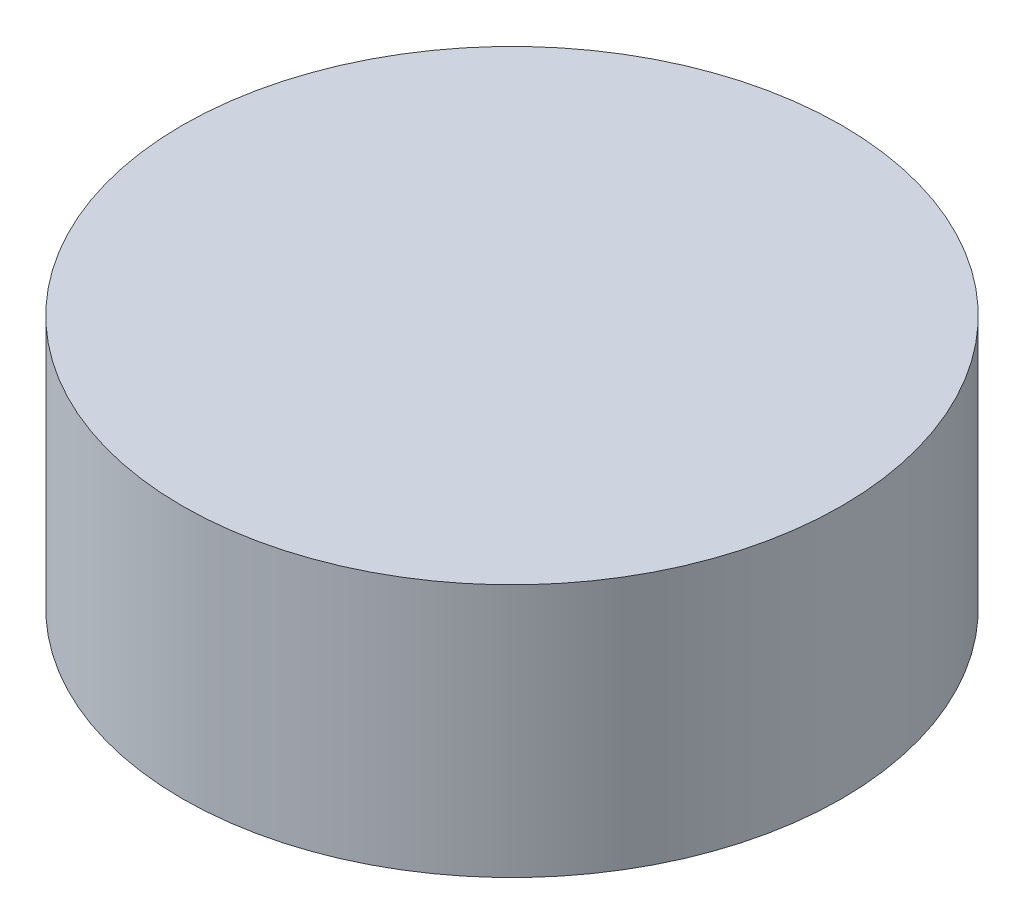
ISO-10303-21;
HEADER;
FILE_DESCRIPTION(('STEP AP214'),'2;1');
FILE_NAME('part.step','',(''),(''),'','','');
FILE_SCHEMA(('AUTOMOTIVE_DESIGN { 1 0 10303 214 1 1 1 1 }'));
ENDSEC;
DATA;
#1=APPLICATION_CONTEXT('core data for automotive mechanical design processes');
#2=APPLICATION_PROTOCOL_DEFINITION('international standard','automotive_design',2000,#1);
#3=PRODUCT_CONTEXT('',#1,'mechanical');
#4=PRODUCT('Part','Part','',(#3));
#5=PRODUCT_RELATED_PRODUCT_CATEGORY('part','',(#4));
#6=PRODUCT_DEFINITION_FORMATION('','',#4);
#7=PRODUCT_DEFINITION_CONTEXT('part definition',#1,'design');
#8=PRODUCT_DEFINITION('design','',#6,#7);
#9=PRODUCT_DEFINITION_SHAPE('','',#8);
#10=(LENGTH_UNIT() NAMED_UNIT(*) SI_UNIT(.MILLI.,.METRE.));
#11=(NAMED_UNIT(*) PLANE_ANGLE_UNIT() SI_UNIT($,.RADIAN.));
#12=(NAMED_UNIT(*) SI_UNIT($,.STERADIAN.) SOLID_ANGLE_UNIT());
#13=UNCERTAINTY_MEASURE_WITH_UNIT(LENGTH_MEASURE(1.E-05),#10,'distance_accuracy_value','');
#14=(GEOMETRIC_REPRESENTATION_CONTEXT(3) GLOBAL_UNCERTAINTY_ASSIGNED_CONTEXT((#13)) GLOBAL_UNIT_ASSIGNED_CONTEXT((#10,
#11,#12)) REPRESENTATION_CONTEXT('',''));
#15=CARTESIAN_POINT('',(0.,0.,0.));
#16=DIRECTION('',(0.,0.,1.));
#17=DIRECTION('',(1.,0.,0.));
#18=AXIS2_PLACEMENT_3D('',#15,#16,#17);
#19=CARTESIAN_POINT('',(0.,24.8,0.));
#20=DIRECTION('',(0.,-1.,0.));
#21=DIRECTION('',(0.,0.,-1.));
#22=AXIS2_PLACEMENT_3D('',#19,#20,#21);
#23=CYLINDRICAL_SURFACE('',#22,32.25);
#24=CARTESIAN_POINT('',(0.,24.8,0.));
#25=DIRECTION('',(0.,1.,0.));
#26=DIRECTION('',(0.,0.,1.));
#27=AXIS2_PLACEMENT_3D('',#24,#25,#26);
#28=CIRCLE('',#27,32.25);
#29=CARTESIAN_POINT('',(0.,24.8,-32.25));
#30=VERTEX_POINT('',#29);
#31=EDGE_CURVE('E10',#30,#30,#28,.T.);
#32=CARTESIAN_POINT('',(0.,0.,0.));
#33=DIRECTION('',(0.,1.,0.));
#34=DIRECTION('',(0.,0.,1.));
#35=AXIS2_PLACEMENT_3D('',#32,#33,#34);
#36=CIRCLE('',#35,32.25);
#37=CARTESIAN_POINT('',(0.,0.,-32.25));
#38=VERTEX_POINT('',#37);
#39=EDGE_CURVE('E35',#38,#38,#36,.T.);
#40=CARTESIAN_POINT('',(0.,24.8,-32.25));
#41=CARTESIAN_POINT('',(0.,24.5416666666667,-32.25));
#42=CARTESIAN_POINT('',(0.,24.2833333333333,-32.25));
#43=CARTESIAN_POINT('',(0.,23.7666666666667,-32.25));
#44=CARTESIAN_POINT('',(0.,23.5083333333333,-32.25));
#45=CARTESIAN_POINT('',(0.,22.9916666666667,-32.25));
#46=CARTESIAN_POINT('',(0.,22.7333333333333,-32.25));
#47=CARTESIAN_POINT('',(0.,22.2166666666667,-32.25));
#48=CARTESIAN_POINT('',(0.,21.9583333333333,-32.25));
#49=CARTESIAN_POINT('',(0.,21.4416666666667,-32.25));
#50=CARTESIAN_POINT('',(0.,21.1833333333333,-32.25));
#51=CARTESIAN_POINT('',(0.,20.6666666666667,-32.25));
#52=CARTESIAN_POINT('',(0.,20.4083333333333,-32.25));
#53=CARTESIAN_POINT('',(0.,19.8916666666667,-32.25));
#54=CARTESIAN_POINT('',(0.,19.6333333333333,-32.25));
#55=CARTESIAN_POINT('',(0.,19.1166666666667,-32.25));
#56=CARTESIAN_POINT('',(0.,18.8583333333333,-32.25));
#57=CARTESIAN_POINT('',(0.,18.3416666666667,-32.25));
#58=CARTESIAN_POINT('',(0.,18.0833333333333,-32.25));
#59=CARTESIAN_POINT('',(0.,17.5666666666667,-32.25));
#60=CARTESIAN_POINT('',(0.,17.3083333333333,-32.25));
#61=CARTESIAN_POINT('',(0.,16.7916666666667,-32.25));
#62=CARTESIAN_POINT('',(0.,16.5333333333333,-32.25));
#63=CARTESIAN_POINT('',(0.,16.0166666666667,-32.25));
#64=CARTESIAN_POINT('',(0.,15.7583333333333,-32.25));
#65=CARTESIAN_POINT('',(0.,15.2416666666667,-32.25));
#66=CARTESIAN_POINT('',(0.,14.9833333333333,-32.25));
#67=CARTESIAN_POINT('',(0.,14.4666666666667,-32.25));
#68=CARTESIAN_POINT('',(0.,14.2083333333333,-32.25));
#69=CARTESIAN_POINT('',(0.,13.6916666666667,-32.25));
#70=CARTESIAN_POINT('',(0.,13.4333333333333,-32.25));
#71=CARTESIAN_POINT('',(0.,12.9166666666667,-32.25));
#72=CARTESIAN_POINT('',(0.,12.6583333333333,-32.25));
#73=CARTESIAN_POINT('',(0.,12.1416666666667,-32.25));
#74=CARTESIAN_POINT('',(0.,11.8833333333333,-32.25));
#75=CARTESIAN_POINT('',(0.,11.3666666666667,-32.25));
#76=CARTESIAN_POINT('',(0.,11.1083333333333,-32.25));
#77=CARTESIAN_POINT('',(0.,10.5916666666667,-32.25));
#78=CARTESIAN_POINT('',(0.,10.3333333333333,-32.25));
#79=CARTESIAN_POINT('',(0.,9.81666666666666,-32.25));
#80=CARTESIAN_POINT('',(0.,9.55833333333333,-32.25));
#81=CARTESIAN_POINT('',(0.,9.04166666666666,-32.25));
#82=CARTESIAN_POINT('',(0.,8.78333333333333,-32.25));
#83=CARTESIAN_POINT('',(0.,8.26666666666667,-32.25));
#84=CARTESIAN_POINT('',(0.,8.00833333333333,-32.25));
#85=CARTESIAN_POINT('',(0.,7.49166666666667,-32.25));
#86=CARTESIAN_POINT('',(0.,7.23333333333333,-32.25));
#87=CARTESIAN_POINT('',(0.,6.71666666666667,-32.25));
#88=CARTESIAN_POINT('',(0.,6.45833333333333,-32.25));
#89=CARTESIAN_POINT('',(0.,5.94166666666667,-32.25));
#90=CARTESIAN_POINT('',(0.,5.68333333333333,-32.25));
#91=CARTESIAN_POINT('',(0.,5.16666666666667,-32.25));
#92=CARTESIAN_POINT('',(0.,4.90833333333333,-32.25));
#93=CARTESIAN_POINT('',(0.,4.39166666666667,-32.25));
#94=CARTESIAN_POINT('',(0.,4.13333333333333,-32.25));
#95=CARTESIAN_POINT('',(0.,3.61666666666667,-32.25));
#96=CARTESIAN_POINT('',(0.,3.35833333333333,-32.25));
#97=CARTESIAN_POINT('',(0.,2.84166666666667,-32.25));
#98=CARTESIAN_POINT('',(0.,2.58333333333333,-32.25));
#99=CARTESIAN_POINT('',(0.,2.06666666666667,-32.25));
#100=CARTESIAN_POINT('',(0.,1.80833333333333,-32.25));
#101=CARTESIAN_POINT('',(0.,1.29166666666667,-32.25));
#102=CARTESIAN_POINT('',(0.,1.03333333333333,-32.25));
#103=CARTESIAN_POINT('',(0.,0.516666666666668,-32.25));
#104=CARTESIAN_POINT('',(0.,0.258333333333334,-32.25));
#105=CARTESIAN_POINT('',(0.,0.,-32.25));
#106=B_SPLINE_CURVE_WITH_KNOTS('',3,(#40,#41,#42,#43,#44,#45,#46,#47,#48,#49,#50,#51,#52,#53,
#54,#55,#56,#57,#58,#59,#60,#61,#62,#63,#64,#65,#66,#67,#68,#69,#70,#71,#72,#73,#74,#75,#76,#77,
#78,#79,#80,#81,#82,#83,#84,#85,#86,#87,#88,#89,#90,#91,#92,#93,#94,#95,#96,#97,#98,#99,#100,
#101,#102,#103,#104,#105),.UNSPECIFIED.,.F.,.F.,(4,2,2,2,2,2,2,2,2,2,2,2,2,2,2,2,2,2,2,2,2,2,2,
2,2,2,2,2,2,2,2,2,4),(0.,0.775000000000001,1.55,2.325,3.1,3.875,4.65,5.425,6.2,6.975,7.75,8.525,
9.3,10.075,10.85,11.625,12.4,13.175,13.95,14.725,15.5,16.275,17.05,17.825,18.6,19.375,20.15,
20.925,21.7,22.475,23.25,24.025,24.8),.UNSPECIFIED.);
#107=EDGE_CURVE('BSEAM32',#30,#38,#106,.T.);
#108=ORIENTED_EDGE('',*,*,#31,.F.);
#109=ORIENTED_EDGE('',*,*,#39,.T.);
#110=ORIENTED_EDGE('',*,*,#107,.T.);
#111=ORIENTED_EDGE('',*,*,#107,.F.);
#112=EDGE_LOOP('',(#108,#110,#109,#111));
#113=FACE_BOUND('',#112,.T.);
#114=ADVANCED_FACE('F32',(#113),#23,.T.);
#115=CARTESIAN_POINT('',(0.,24.8,0.));
#116=DIRECTION('',(0.,1.,0.));
#117=DIRECTION('',(0.,0.,1.));
#118=AXIS2_PLACEMENT_3D('',#115,#116,#117);
#119=PLANE('',#118);
#120=ORIENTED_EDGE('',*,*,#31,.T.);
#121=EDGE_LOOP('',(#120));
#122=FACE_BOUND('',#121,.T.);
#123=ADVANCED_FACE('F47',(#122),#119,.T.);
#124=CARTESIAN_POINT('',(0.,0.,0.));
#125=DIRECTION('',(0.,1.,0.));
#126=DIRECTION('',(0.,0.,1.));
#127=AXIS2_PLACEMENT_3D('',#124,#125,#126);
#128=PLANE('',#127);
#129=ORIENTED_EDGE('',*,*,#39,.F.);
#130=EDGE_LOOP('',(#129));
#131=FACE_BOUND('',#130,.T.);
#132=ADVANCED_FACE('F45',(#131),#128,.F.);
#133=CLOSED_SHELL('',(#114,#123,#132));
#134=MANIFOLD_SOLID_BREP('B2',#133);
#135=ADVANCED_BREP_SHAPE_REPRESENTATION('',(#18,#134),#14);
#136=SHAPE_DEFINITION_REPRESENTATION(#9,#135);
ENDSEC;
END-ISO-10303-21;
